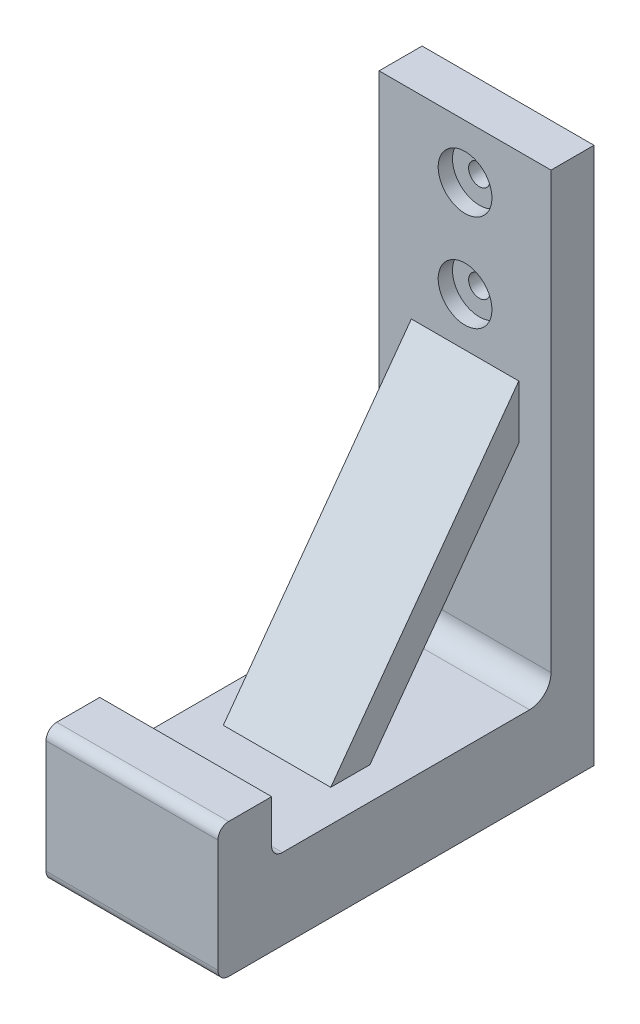
ISO-10303-21;
HEADER;
FILE_DESCRIPTION(('STEP AP214'),'2;1');
FILE_NAME('part.step','',(''),(''),'','','');
FILE_SCHEMA(('AUTOMOTIVE_DESIGN { 1 0 10303 214 1 1 1 1 }'));
ENDSEC;
DATA;
#1=APPLICATION_CONTEXT('core data for automotive mechanical design processes');
#2=APPLICATION_PROTOCOL_DEFINITION('international standard','automotive_design',2000,#1);
#3=PRODUCT_CONTEXT('',#1,'mechanical');
#4=PRODUCT('Part','Part','',(#3));
#5=PRODUCT_RELATED_PRODUCT_CATEGORY('part','',(#4));
#6=PRODUCT_DEFINITION_FORMATION('','',#4);
#7=PRODUCT_DEFINITION_CONTEXT('part definition',#1,'design');
#8=PRODUCT_DEFINITION('design','',#6,#7);
#9=PRODUCT_DEFINITION_SHAPE('','',#8);
#10=(LENGTH_UNIT() NAMED_UNIT(*) SI_UNIT(.MILLI.,.METRE.));
#11=(NAMED_UNIT(*) PLANE_ANGLE_UNIT() SI_UNIT($,.RADIAN.));
#12=(NAMED_UNIT(*) SI_UNIT($,.STERADIAN.) SOLID_ANGLE_UNIT());
#13=UNCERTAINTY_MEASURE_WITH_UNIT(LENGTH_MEASURE(1.E-05),#10,'distance_accuracy_value','');
#14=(GEOMETRIC_REPRESENTATION_CONTEXT(3) GLOBAL_UNCERTAINTY_ASSIGNED_CONTEXT((#13)) GLOBAL_UNIT_ASSIGNED_CONTEXT((#10,
#11,#12)) REPRESENTATION_CONTEXT('',''));
#15=CARTESIAN_POINT('',(0.,0.,0.));
#16=DIRECTION('',(0.,0.,1.));
#17=DIRECTION('',(1.,0.,0.));
#18=AXIS2_PLACEMENT_3D('',#15,#16,#17);
#19=CARTESIAN_POINT('',(20.32,127.,10.16));
#20=DIRECTION('',(0.,0.,-1.));
#21=DIRECTION('',(0.,1.,0.));
#22=AXIS2_PLACEMENT_3D('',#19,#20,#21);
#23=PLANE('',#22);
#24=CARTESIAN_POINT('',(0.,91.44,10.16));
#25=DIRECTION('',(0.,0.,1.));
#26=DIRECTION('',(1.,0.,0.));
#27=AXIS2_PLACEMENT_3D('',#24,#25,#26);
#28=CIRCLE('',#27,6.35);
#29=CARTESIAN_POINT('',(6.35,91.44,10.16));
#30=VERTEX_POINT('',#29);
#31=EDGE_CURVE('E361',#30,#30,#28,.T.);
#32=ORIENTED_EDGE('',*,*,#31,.F.);
#33=EDGE_LOOP('',(#32));
#34=FACE_BOUND('',#33,.T.);
#35=CARTESIAN_POINT('',(0.,114.3,10.16));
#36=DIRECTION('',(0.,0.,1.));
#37=DIRECTION('',(1.,0.,0.));
#38=AXIS2_PLACEMENT_3D('',#35,#36,#37);
#39=CIRCLE('',#38,6.35);
#40=CARTESIAN_POINT('',(6.35,114.3,10.16));
#41=VERTEX_POINT('',#40);
#42=EDGE_CURVE('E343',#41,#41,#39,.T.);
#43=ORIENTED_EDGE('',*,*,#42,.F.);
#44=EDGE_LOOP('',(#43));
#45=FACE_BOUND('',#44,.T.);
#46=DIRECTION('',(0.,-1.,0.));
#47=VECTOR('',#46,1.);
#48=CARTESIAN_POINT('',(-20.32,127.,10.16));
#49=LINE('',#48,#47);
#50=CARTESIAN_POINT('',(-20.32,127.,10.16));
#51=VERTEX_POINT('',#50);
#52=CARTESIAN_POINT('',(-20.32,24.13,10.16));
#53=VERTEX_POINT('',#52);
#54=EDGE_CURVE('E240',#51,#53,#49,.T.);
#55=ORIENTED_EDGE('',*,*,#54,.T.);
#56=DIRECTION('',(-1.,0.,0.));
#57=VECTOR('',#56,1.);
#58=CARTESIAN_POINT('',(20.32,24.13,10.16));
#59=LINE('',#58,#57);
#60=CARTESIAN_POINT('',(20.32,24.13,10.16));
#61=VERTEX_POINT('',#60);
#62=EDGE_CURVE('E275',#53,#61,#59,.F.);
#63=ORIENTED_EDGE('',*,*,#62,.T.);
#64=DIRECTION('',(0.,-1.,0.));
#65=VECTOR('',#64,1.);
#66=CARTESIAN_POINT('',(20.32,127.,10.16));
#67=LINE('',#66,#65);
#68=CARTESIAN_POINT('',(20.32,127.,10.16));
#69=VERTEX_POINT('',#68);
#70=EDGE_CURVE('E212',#69,#61,#67,.T.);
#71=ORIENTED_EDGE('',*,*,#70,.F.);
#72=DIRECTION('',(-1.,0.,0.));
#73=VECTOR('',#72,1.);
#74=CARTESIAN_POINT('',(20.32,127.,10.16));
#75=LINE('',#74,#73);
#76=EDGE_CURVE('E257',#69,#51,#75,.T.);
#77=ORIENTED_EDGE('',*,*,#76,.T.);
#78=EDGE_LOOP('',(#55,#63,#71,#77));
#79=FACE_BOUND('',#78,.T.);
#80=DIRECTION('',(-1.,0.,0.));
#81=VECTOR('',#80,1.);
#82=CARTESIAN_POINT('',(12.7,80.01,10.16));
#83=LINE('',#82,#81);
#84=CARTESIAN_POINT('',(12.7,80.01,10.16));
#85=VERTEX_POINT('',#84);
#86=CARTESIAN_POINT('',(-12.7,80.01,10.16));
#87=VERTEX_POINT('',#86);
#88=EDGE_CURVE('E167',#85,#87,#83,.T.);
#89=ORIENTED_EDGE('',*,*,#88,.F.);
#90=DIRECTION('',(0.,1.,0.));
#91=VECTOR('',#90,1.);
#92=CARTESIAN_POINT('',(12.7,67.31,10.16));
#93=LINE('',#92,#91);
#94=CARTESIAN_POINT('',(12.7,67.31,10.16));
#95=VERTEX_POINT('',#94);
#96=EDGE_CURVE('E165',#95,#85,#93,.T.);
#97=ORIENTED_EDGE('',*,*,#96,.F.);
#98=DIRECTION('',(-1.,0.,0.));
#99=VECTOR('',#98,1.);
#100=CARTESIAN_POINT('',(12.7,67.31,10.16));
#101=LINE('',#100,#99);
#102=CARTESIAN_POINT('',(-12.7,67.31,10.16));
#103=VERTEX_POINT('',#102);
#104=EDGE_CURVE('E157',#95,#103,#101,.T.);
#105=ORIENTED_EDGE('',*,*,#104,.T.);
#106=DIRECTION('',(0.,1.,0.));
#107=VECTOR('',#106,1.);
#108=CARTESIAN_POINT('',(-12.7,67.31,10.16));
#109=LINE('',#108,#107);
#110=EDGE_CURVE('E163',#103,#87,#109,.T.);
#111=ORIENTED_EDGE('',*,*,#110,.T.);
#112=EDGE_LOOP('',(#89,#97,#105,#111));
#113=FACE_BOUND('',#112,.T.);
#114=ADVANCED_FACE('F44',(#34,#45,#79,#113),#23,.F.);
#115=CARTESIAN_POINT('',(20.32,19.05,10.16));
#116=DIRECTION('',(0.,-1.,0.));
#117=DIRECTION('',(0.,0.,-1.));
#118=AXIS2_PLACEMENT_3D('',#115,#116,#117);
#119=PLANE('',#118);
#120=DIRECTION('',(0.,0.,1.));
#121=VECTOR('',#120,1.);
#122=CARTESIAN_POINT('',(-20.32,19.05,10.16));
#123=LINE('',#122,#121);
#124=CARTESIAN_POINT('',(-20.32,19.05,15.24));
#125=VERTEX_POINT('',#124);
#126=CARTESIAN_POINT('',(-20.32,19.05,73.66));
#127=VERTEX_POINT('',#126);
#128=EDGE_CURVE('E241',#125,#127,#123,.T.);
#129=ORIENTED_EDGE('',*,*,#128,.T.);
#130=DIRECTION('',(-1.,0.,0.));
#131=VECTOR('',#130,1.);
#132=CARTESIAN_POINT('',(20.32,19.05,73.66));
#133=LINE('',#132,#131);
#134=CARTESIAN_POINT('',(20.32,19.05,73.66));
#135=VERTEX_POINT('',#134);
#136=EDGE_CURVE('E283',#127,#135,#133,.F.);
#137=ORIENTED_EDGE('',*,*,#136,.T.);
#138=DIRECTION('',(0.,0.,1.));
#139=VECTOR('',#138,1.);
#140=CARTESIAN_POINT('',(20.32,19.05,10.16));
#141=LINE('',#140,#139);
#142=CARTESIAN_POINT('',(20.32,19.05,15.24));
#143=VERTEX_POINT('',#142);
#144=EDGE_CURVE('E213',#143,#135,#141,.T.);
#145=ORIENTED_EDGE('',*,*,#144,.F.);
#146=DIRECTION('',(-1.,0.,0.));
#147=VECTOR('',#146,1.);
#148=CARTESIAN_POINT('',(-20.32,19.05,15.24));
#149=LINE('',#148,#147);
#150=EDGE_CURVE('E267',#143,#125,#149,.T.);
#151=ORIENTED_EDGE('',*,*,#150,.T.);
#152=EDGE_LOOP('',(#129,#137,#145,#151));
#153=FACE_BOUND('',#152,.T.);
#154=DIRECTION('',(0.,0.,-1.));
#155=VECTOR('',#154,1.);
#156=CARTESIAN_POINT('',(12.7,19.05,54.61));
#157=LINE('',#156,#155);
#158=CARTESIAN_POINT('',(12.7,19.05,54.61));
#159=VERTEX_POINT('',#158);
#160=CARTESIAN_POINT('',(12.7,19.05,45.3495833333333));
#161=VERTEX_POINT('',#160);
#162=EDGE_CURVE('E189',#159,#161,#157,.T.);
#163=ORIENTED_EDGE('',*,*,#162,.F.);
#164=DIRECTION('',(-1.,0.,0.));
#165=VECTOR('',#164,1.);
#166=CARTESIAN_POINT('',(12.7,19.05,54.61));
#167=LINE('',#166,#165);
#168=CARTESIAN_POINT('',(-12.7,19.05,54.61));
#169=VERTEX_POINT('',#168);
#170=EDGE_CURVE('E195',#159,#169,#167,.T.);
#171=ORIENTED_EDGE('',*,*,#170,.T.);
#172=DIRECTION('',(0.,0.,-1.));
#173=VECTOR('',#172,1.);
#174=CARTESIAN_POINT('',(-12.7,19.05,54.61));
#175=LINE('',#174,#173);
#176=CARTESIAN_POINT('',(-12.7,19.05,45.3495833333333));
#177=VERTEX_POINT('',#176);
#178=EDGE_CURVE('E177',#169,#177,#175,.T.);
#179=ORIENTED_EDGE('',*,*,#178,.T.);
#180=DIRECTION('',(-1.,0.,0.));
#181=VECTOR('',#180,1.);
#182=CARTESIAN_POINT('',(12.7,19.05,45.3495833333333));
#183=LINE('',#182,#181);
#184=EDGE_CURVE('E169',#161,#177,#183,.T.);
#185=ORIENTED_EDGE('',*,*,#184,.F.);
#186=EDGE_LOOP('',(#163,#171,#179,#185));
#187=FACE_BOUND('',#186,.T.);
#188=ADVANCED_FACE('F375',(#153,#187),#119,.F.);
#189=CARTESIAN_POINT('',(20.32,0.,88.9));
#190=DIRECTION('',(0.,1.,0.));
#191=DIRECTION('',(0.,0.,1.));
#192=AXIS2_PLACEMENT_3D('',#189,#190,#191);
#193=PLANE('',#192);
#194=DIRECTION('',(0.,0.,-1.));
#195=VECTOR('',#194,1.);
#196=CARTESIAN_POINT('',(20.32,0.,88.9));
#197=LINE('',#196,#195);
#198=CARTESIAN_POINT('',(20.32,0.,86.36));
#199=VERTEX_POINT('',#198);
#200=CARTESIAN_POINT('',(20.32,0.,0.));
#201=VERTEX_POINT('',#200);
#202=EDGE_CURVE('E201',#199,#201,#197,.T.);
#203=ORIENTED_EDGE('',*,*,#202,.F.);
#204=DIRECTION('',(-1.,0.,0.));
#205=VECTOR('',#204,1.);
#206=CARTESIAN_POINT('',(20.32,0.,86.36));
#207=LINE('',#206,#205);
#208=CARTESIAN_POINT('',(-20.32,0.,86.36));
#209=VERTEX_POINT('',#208);
#210=EDGE_CURVE('E295',#199,#209,#207,.T.);
#211=ORIENTED_EDGE('',*,*,#210,.T.);
#212=DIRECTION('',(0.,0.,-1.));
#213=VECTOR('',#212,1.);
#214=CARTESIAN_POINT('',(-20.32,0.,88.9));
#215=LINE('',#214,#213);
#216=CARTESIAN_POINT('',(-20.32,0.,0.));
#217=VERTEX_POINT('',#216);
#218=EDGE_CURVE('E198',#209,#217,#215,.T.);
#219=ORIENTED_EDGE('',*,*,#218,.T.);
#220=DIRECTION('',(-1.,0.,0.));
#221=VECTOR('',#220,1.);
#222=CARTESIAN_POINT('',(20.32,0.,0.));
#223=LINE('',#222,#221);
#224=EDGE_CURVE('E261',#201,#217,#223,.T.);
#225=ORIENTED_EDGE('',*,*,#224,.F.);
#226=EDGE_LOOP('',(#203,#211,#219,#225));
#227=FACE_BOUND('',#226,.T.);
#228=ADVANCED_FACE('F418',(#227),#193,.F.);
#229=CARTESIAN_POINT('',(20.32,0.,0.));
#230=DIRECTION('',(0.,0.,1.));
#231=DIRECTION('',(1.,0.,0.));
#232=AXIS2_PLACEMENT_3D('',#229,#230,#231);
#233=PLANE('',#232);
#234=CARTESIAN_POINT('',(0.,91.44,0.));
#235=DIRECTION('',(0.,0.,1.));
#236=DIRECTION('',(1.,0.,0.));
#237=AXIS2_PLACEMENT_3D('',#234,#235,#236);
#238=CIRCLE('',#237,2.54);
#239=CARTESIAN_POINT('',(2.54,91.44,0.));
#240=VERTEX_POINT('',#239);
#241=EDGE_CURVE('E351',#240,#240,#238,.T.);
#242=ORIENTED_EDGE('',*,*,#241,.T.);
#243=EDGE_LOOP('',(#242));
#244=FACE_BOUND('',#243,.T.);
#245=CARTESIAN_POINT('',(0.,114.3,0.));
#246=DIRECTION('',(0.,0.,1.));
#247=DIRECTION('',(1.,0.,0.));
#248=AXIS2_PLACEMENT_3D('',#245,#246,#247);
#249=CIRCLE('',#248,2.54);
#250=CARTESIAN_POINT('',(2.54,114.3,0.));
#251=VERTEX_POINT('',#250);
#252=EDGE_CURVE('E326',#251,#251,#249,.T.);
#253=ORIENTED_EDGE('',*,*,#252,.T.);
#254=EDGE_LOOP('',(#253));
#255=FACE_BOUND('',#254,.T.);
#256=DIRECTION('',(0.,1.,0.));
#257=VECTOR('',#256,1.);
#258=CARTESIAN_POINT('',(-20.32,0.,0.));
#259=LINE('',#258,#257);
#260=CARTESIAN_POINT('',(-20.32,127.,0.));
#261=VERTEX_POINT('',#260);
#262=EDGE_CURVE('E233',#217,#261,#259,.T.);
#263=ORIENTED_EDGE('',*,*,#262,.T.);
#264=DIRECTION('',(-1.,0.,0.));
#265=VECTOR('',#264,1.);
#266=CARTESIAN_POINT('',(20.32,127.,0.));
#267=LINE('',#266,#265);
#268=CARTESIAN_POINT('',(20.32,127.,0.));
#269=VERTEX_POINT('',#268);
#270=EDGE_CURVE('E258',#269,#261,#267,.T.);
#271=ORIENTED_EDGE('',*,*,#270,.F.);
#272=DIRECTION('',(0.,1.,0.));
#273=VECTOR('',#272,1.);
#274=CARTESIAN_POINT('',(20.32,0.,0.));
#275=LINE('',#274,#273);
#276=EDGE_CURVE('E203',#201,#269,#275,.T.);
#277=ORIENTED_EDGE('',*,*,#276,.F.);
#278=ORIENTED_EDGE('',*,*,#224,.T.);
#279=EDGE_LOOP('',(#263,#271,#277,#278));
#280=FACE_BOUND('',#279,.T.);
#281=ADVANCED_FACE('F423',(#244,#255,#280),#233,.F.);
#282=CARTESIAN_POINT('',(20.32,127.,0.));
#283=DIRECTION('',(0.,-1.,0.));
#284=DIRECTION('',(0.,0.,-1.));
#285=AXIS2_PLACEMENT_3D('',#282,#283,#284);
#286=PLANE('',#285);
#287=DIRECTION('',(0.,0.,1.));
#288=VECTOR('',#287,1.);
#289=CARTESIAN_POINT('',(-20.32,127.,0.));
#290=LINE('',#289,#288);
#291=EDGE_CURVE('E234',#261,#51,#290,.T.);
#292=ORIENTED_EDGE('',*,*,#291,.T.);
#293=ORIENTED_EDGE('',*,*,#76,.F.);
#294=DIRECTION('',(0.,0.,1.));
#295=VECTOR('',#294,1.);
#296=CARTESIAN_POINT('',(20.32,127.,0.));
#297=LINE('',#296,#295);
#298=EDGE_CURVE('E206',#269,#69,#297,.T.);
#299=ORIENTED_EDGE('',*,*,#298,.F.);
#300=ORIENTED_EDGE('',*,*,#270,.T.);
#301=EDGE_LOOP('',(#292,#293,#299,#300));
#302=FACE_BOUND('',#301,.T.);
#303=ADVANCED_FACE('F424',(#302),#286,.F.);
#304=CARTESIAN_POINT('',(20.32,19.05,76.2));
#305=DIRECTION('',(0.,0.,1.));
#306=DIRECTION('',(0.,-1.,0.));
#307=AXIS2_PLACEMENT_3D('',#304,#305,#306);
#308=PLANE('',#307);
#309=DIRECTION('',(0.,1.,0.));
#310=VECTOR('',#309,1.);
#311=CARTESIAN_POINT('',(20.32,19.05,76.2));
#312=LINE('',#311,#310);
#313=CARTESIAN_POINT('',(20.32,21.59,76.2));
#314=VERTEX_POINT('',#313);
#315=CARTESIAN_POINT('',(20.32,31.75,76.2));
#316=VERTEX_POINT('',#315);
#317=EDGE_CURVE('E216',#314,#316,#312,.T.);
#318=ORIENTED_EDGE('',*,*,#317,.F.);
#319=DIRECTION('',(-1.,0.,0.));
#320=VECTOR('',#319,1.);
#321=CARTESIAN_POINT('',(-20.32,21.59,76.2));
#322=LINE('',#321,#320);
#323=CARTESIAN_POINT('',(-20.32,21.59,76.2));
#324=VERTEX_POINT('',#323);
#325=EDGE_CURVE('E282',#314,#324,#322,.T.);
#326=ORIENTED_EDGE('',*,*,#325,.T.);
#327=DIRECTION('',(0.,1.,0.));
#328=VECTOR('',#327,1.);
#329=CARTESIAN_POINT('',(-20.32,19.05,76.2));
#330=LINE('',#329,#328);
#331=CARTESIAN_POINT('',(-20.32,31.75,76.2));
#332=VERTEX_POINT('',#331);
#333=EDGE_CURVE('E244',#324,#332,#330,.T.);
#334=ORIENTED_EDGE('',*,*,#333,.T.);
#335=DIRECTION('',(-1.,0.,0.));
#336=VECTOR('',#335,1.);
#337=CARTESIAN_POINT('',(20.32,31.75,76.2));
#338=LINE('',#337,#336);
#339=EDGE_CURVE('E226',#316,#332,#338,.T.);
#340=ORIENTED_EDGE('',*,*,#339,.F.);
#341=EDGE_LOOP('',(#318,#326,#334,#340));
#342=FACE_BOUND('',#341,.T.);
#343=ADVANCED_FACE('F397',(#342),#308,.F.);
#344=CARTESIAN_POINT('',(20.32,31.75,76.2));
#345=DIRECTION('',(0.,-1.,0.));
#346=DIRECTION('',(0.,0.,-1.));
#347=AXIS2_PLACEMENT_3D('',#344,#345,#346);
#348=PLANE('',#347);
#349=DIRECTION('',(0.,0.,1.));
#350=VECTOR('',#349,1.);
#351=CARTESIAN_POINT('',(-20.32,31.75,76.2));
#352=LINE('',#351,#350);
#353=CARTESIAN_POINT('',(-20.32,31.75,86.36));
#354=VERTEX_POINT('',#353);
#355=EDGE_CURVE('E247',#332,#354,#352,.T.);
#356=ORIENTED_EDGE('',*,*,#355,.T.);
#357=DIRECTION('',(-1.,0.,0.));
#358=VECTOR('',#357,1.);
#359=CARTESIAN_POINT('',(20.32,31.75,86.36));
#360=LINE('',#359,#358);
#361=CARTESIAN_POINT('',(20.32,31.75,86.36));
#362=VERTEX_POINT('',#361);
#363=EDGE_CURVE('E53',#354,#362,#360,.F.);
#364=ORIENTED_EDGE('',*,*,#363,.T.);
#365=DIRECTION('',(0.,0.,1.));
#366=VECTOR('',#365,1.);
#367=CARTESIAN_POINT('',(20.32,31.75,76.2));
#368=LINE('',#367,#366);
#369=EDGE_CURVE('E225',#316,#362,#368,.T.);
#370=ORIENTED_EDGE('',*,*,#369,.F.);
#371=ORIENTED_EDGE('',*,*,#339,.T.);
#372=EDGE_LOOP('',(#356,#364,#370,#371));
#373=FACE_BOUND('',#372,.T.);
#374=ADVANCED_FACE('F399',(#373),#348,.F.);
#375=CARTESIAN_POINT('',(20.32,31.75,88.9));
#376=DIRECTION('',(0.,0.,-1.));
#377=DIRECTION('',(-1.,0.,0.));
#378=AXIS2_PLACEMENT_3D('',#375,#376,#377);
#379=PLANE('',#378);
#380=DIRECTION('',(0.,-1.,0.));
#381=VECTOR('',#380,1.);
#382=CARTESIAN_POINT('',(20.32,31.75,88.9));
#383=LINE('',#382,#381);
#384=CARTESIAN_POINT('',(20.32,29.21,88.9));
#385=VERTEX_POINT('',#384);
#386=CARTESIAN_POINT('',(20.32,2.54,88.9));
#387=VERTEX_POINT('',#386);
#388=EDGE_CURVE('E224',#385,#387,#383,.T.);
#389=ORIENTED_EDGE('',*,*,#388,.F.);
#390=DIRECTION('',(-1.,0.,0.));
#391=VECTOR('',#390,1.);
#392=CARTESIAN_POINT('',(20.32,29.21,88.9));
#393=LINE('',#392,#391);
#394=CARTESIAN_POINT('',(-20.32,29.21,88.9));
#395=VERTEX_POINT('',#394);
#396=EDGE_CURVE('E307',#385,#395,#393,.T.);
#397=ORIENTED_EDGE('',*,*,#396,.T.);
#398=DIRECTION('',(0.,-1.,0.));
#399=VECTOR('',#398,1.);
#400=CARTESIAN_POINT('',(-20.32,31.75,88.9));
#401=LINE('',#400,#399);
#402=CARTESIAN_POINT('',(-20.32,2.54,88.9));
#403=VERTEX_POINT('',#402);
#404=EDGE_CURVE('E204',#395,#403,#401,.T.);
#405=ORIENTED_EDGE('',*,*,#404,.T.);
#406=DIRECTION('',(-1.,0.,0.));
#407=VECTOR('',#406,1.);
#408=CARTESIAN_POINT('',(20.32,2.54,88.9));
#409=LINE('',#408,#407);
#410=EDGE_CURVE('E305',#403,#387,#409,.F.);
#411=ORIENTED_EDGE('',*,*,#410,.T.);
#412=EDGE_LOOP('',(#389,#397,#405,#411));
#413=FACE_BOUND('',#412,.T.);
#414=ADVANCED_FACE('F407',(#413),#379,.F.);
#415=CARTESIAN_POINT('',(20.32,0.,0.));
#416=DIRECTION('',(1.,0.,0.));
#417=DIRECTION('',(0.,0.,-1.));
#418=AXIS2_PLACEMENT_3D('',#415,#416,#417);
#419=PLANE('',#418);
#420=ORIENTED_EDGE('',*,*,#369,.T.);
#421=CARTESIAN_POINT('',(20.32,29.21,86.36));
#422=DIRECTION('',(1.,0.,0.));
#423=DIRECTION('',(0.,0.,-1.));
#424=AXIS2_PLACEMENT_3D('',#421,#422,#423);
#425=CIRCLE('',#424,2.54);
#426=EDGE_CURVE('E11',#362,#385,#425,.T.);
#427=ORIENTED_EDGE('',*,*,#426,.T.);
#428=ORIENTED_EDGE('',*,*,#388,.T.);
#429=CARTESIAN_POINT('',(20.32,2.54,86.36));
#430=DIRECTION('',(1.,0.,0.));
#431=DIRECTION('',(0.,0.,-1.));
#432=AXIS2_PLACEMENT_3D('',#429,#430,#431);
#433=CIRCLE('',#432,2.54);
#434=EDGE_CURVE('E306',#387,#199,#433,.T.);
#435=ORIENTED_EDGE('',*,*,#434,.T.);
#436=ORIENTED_EDGE('',*,*,#202,.T.);
#437=ORIENTED_EDGE('',*,*,#276,.T.);
#438=ORIENTED_EDGE('',*,*,#298,.T.);
#439=ORIENTED_EDGE('',*,*,#70,.T.);
#440=CARTESIAN_POINT('',(20.32,24.13,15.24));
#441=DIRECTION('',(1.,0.,0.));
#442=DIRECTION('',(0.,0.,-1.));
#443=AXIS2_PLACEMENT_3D('',#440,#441,#442);
#444=CIRCLE('',#443,5.08);
#445=EDGE_CURVE('E279',#61,#143,#444,.F.);
#446=ORIENTED_EDGE('',*,*,#445,.T.);
#447=ORIENTED_EDGE('',*,*,#144,.T.);
#448=CARTESIAN_POINT('',(20.32,21.59,73.66));
#449=DIRECTION('',(1.,0.,0.));
#450=DIRECTION('',(0.,0.,-1.));
#451=AXIS2_PLACEMENT_3D('',#448,#449,#450);
#452=CIRCLE('',#451,2.54);
#453=EDGE_CURVE('E293',#135,#314,#452,.F.);
#454=ORIENTED_EDGE('',*,*,#453,.T.);
#455=ORIENTED_EDGE('',*,*,#317,.T.);
#456=EDGE_LOOP('',(#420,#427,#428,#435,#436,#437,#438,#439,#446,#447,#454,#455));
#457=FACE_BOUND('',#456,.T.);
#458=ADVANCED_FACE('F390',(#457),#419,.T.);
#459=CARTESIAN_POINT('',(-20.32,0.,0.));
#460=DIRECTION('',(1.,0.,0.));
#461=DIRECTION('',(0.,0.,-1.));
#462=AXIS2_PLACEMENT_3D('',#459,#460,#461);
#463=PLANE('',#462);
#464=ORIENTED_EDGE('',*,*,#404,.F.);
#465=CARTESIAN_POINT('',(-20.32,29.21,86.36));
#466=DIRECTION('',(1.,0.,0.));
#467=DIRECTION('',(0.,0.,-1.));
#468=AXIS2_PLACEMENT_3D('',#465,#466,#467);
#469=CIRCLE('',#468,2.54);
#470=EDGE_CURVE('E69',#395,#354,#469,.F.);
#471=ORIENTED_EDGE('',*,*,#470,.T.);
#472=ORIENTED_EDGE('',*,*,#355,.F.);
#473=ORIENTED_EDGE('',*,*,#333,.F.);
#474=CARTESIAN_POINT('',(-20.32,21.59,73.66));
#475=DIRECTION('',(1.,0.,0.));
#476=DIRECTION('',(0.,0.,-1.));
#477=AXIS2_PLACEMENT_3D('',#474,#475,#476);
#478=CIRCLE('',#477,2.54);
#479=EDGE_CURVE('E287',#324,#127,#478,.T.);
#480=ORIENTED_EDGE('',*,*,#479,.T.);
#481=ORIENTED_EDGE('',*,*,#128,.F.);
#482=CARTESIAN_POINT('',(-20.32,24.13,15.24));
#483=DIRECTION('',(1.,0.,0.));
#484=DIRECTION('',(0.,0.,-1.));
#485=AXIS2_PLACEMENT_3D('',#482,#483,#484);
#486=CIRCLE('',#485,5.08);
#487=EDGE_CURVE('E273',#125,#53,#486,.T.);
#488=ORIENTED_EDGE('',*,*,#487,.T.);
#489=ORIENTED_EDGE('',*,*,#54,.F.);
#490=ORIENTED_EDGE('',*,*,#291,.F.);
#491=ORIENTED_EDGE('',*,*,#262,.F.);
#492=ORIENTED_EDGE('',*,*,#218,.F.);
#493=CARTESIAN_POINT('',(-20.32,2.54,86.36));
#494=DIRECTION('',(1.,0.,0.));
#495=DIRECTION('',(0.,0.,-1.));
#496=AXIS2_PLACEMENT_3D('',#493,#494,#495);
#497=CIRCLE('',#496,2.54);
#498=EDGE_CURVE('E296',#209,#403,#497,.F.);
#499=ORIENTED_EDGE('',*,*,#498,.T.);
#500=EDGE_LOOP('',(#464,#471,#472,#473,#480,#481,#488,#489,#490,#491,#492,#499));
#501=FACE_BOUND('',#500,.T.);
#502=ADVANCED_FACE('F410',(#501),#463,.F.);
#503=CARTESIAN_POINT('',(12.7,19.05,45.3495833333333));
#504=DIRECTION('',(0.,0.589172157449442,0.808007530216377));
#505=DIRECTION('',(0.,-0.808007530216378,0.589172157449442));
#506=AXIS2_PLACEMENT_3D('',#503,#504,#505);
#507=PLANE('',#506);
#508=DIRECTION('',(0.,0.808007530216377,-0.589172157449442));
#509=VECTOR('',#508,1.);
#510=CARTESIAN_POINT('',(-12.7,19.05,45.3495833333333));
#511=LINE('',#510,#509);
#512=EDGE_CURVE('E172',#177,#103,#511,.T.);
#513=ORIENTED_EDGE('',*,*,#512,.T.);
#514=ORIENTED_EDGE('',*,*,#104,.F.);
#515=DIRECTION('',(0.,0.808007530216377,-0.589172157449442));
#516=VECTOR('',#515,1.);
#517=CARTESIAN_POINT('',(12.7,19.05,45.3495833333333));
#518=LINE('',#517,#516);
#519=EDGE_CURVE('E318',#161,#95,#518,.T.);
#520=ORIENTED_EDGE('',*,*,#519,.F.);
#521=ORIENTED_EDGE('',*,*,#184,.T.);
#522=EDGE_LOOP('',(#513,#514,#520,#521));
#523=FACE_BOUND('',#522,.T.);
#524=ADVANCED_FACE('F174',(#523),#507,.F.);
#525=CARTESIAN_POINT('',(12.7,19.05,54.61));
#526=DIRECTION('',(0.,0.589172157449442,0.808007530216378));
#527=DIRECTION('',(0.,-0.808007530216378,0.589172157449442));
#528=AXIS2_PLACEMENT_3D('',#525,#526,#527);
#529=PLANE('',#528);
#530=DIRECTION('',(0.,0.808007530216378,-0.589172157449442));
#531=VECTOR('',#530,1.);
#532=CARTESIAN_POINT('',(-12.7,19.05,54.61));
#533=LINE('',#532,#531);
#534=EDGE_CURVE('E183',#169,#87,#533,.T.);
#535=ORIENTED_EDGE('',*,*,#534,.F.);
#536=ORIENTED_EDGE('',*,*,#170,.F.);
#537=DIRECTION('',(0.,0.808007530216378,-0.589172157449442));
#538=VECTOR('',#537,1.);
#539=CARTESIAN_POINT('',(12.7,19.05,54.61));
#540=LINE('',#539,#538);
#541=EDGE_CURVE('E193',#159,#85,#540,.T.);
#542=ORIENTED_EDGE('',*,*,#541,.T.);
#543=ORIENTED_EDGE('',*,*,#88,.T.);
#544=EDGE_LOOP('',(#535,#536,#542,#543));
#545=FACE_BOUND('',#544,.T.);
#546=ADVANCED_FACE('F597',(#545),#529,.T.);
#547=CARTESIAN_POINT('',(12.7,0.,0.));
#548=DIRECTION('',(1.,0.,0.));
#549=DIRECTION('',(0.,0.,-1.));
#550=AXIS2_PLACEMENT_3D('',#547,#548,#549);
#551=PLANE('',#550);
#552=ORIENTED_EDGE('',*,*,#162,.T.);
#553=ORIENTED_EDGE('',*,*,#519,.T.);
#554=ORIENTED_EDGE('',*,*,#96,.T.);
#555=ORIENTED_EDGE('',*,*,#541,.F.);
#556=EDGE_LOOP('',(#552,#553,#554,#555));
#557=FACE_BOUND('',#556,.T.);
#558=ADVANCED_FACE('F590',(#557),#551,.T.);
#559=CARTESIAN_POINT('',(-12.7,0.,0.));
#560=DIRECTION('',(1.,0.,0.));
#561=DIRECTION('',(0.,0.,-1.));
#562=AXIS2_PLACEMENT_3D('',#559,#560,#561);
#563=PLANE('',#562);
#564=ORIENTED_EDGE('',*,*,#178,.F.);
#565=ORIENTED_EDGE('',*,*,#534,.T.);
#566=ORIENTED_EDGE('',*,*,#110,.F.);
#567=ORIENTED_EDGE('',*,*,#512,.F.);
#568=EDGE_LOOP('',(#564,#565,#566,#567));
#569=FACE_BOUND('',#568,.T.);
#570=ADVANCED_FACE('F185',(#569),#563,.F.);
#571=CARTESIAN_POINT('',(0.,114.3,10.16));
#572=DIRECTION('',(0.,0.,1.));
#573=DIRECTION('',(1.,0.,0.));
#574=AXIS2_PLACEMENT_3D('',#571,#572,#573);
#575=CYLINDRICAL_SURFACE('',#574,2.54);
#576=ORIENTED_EDGE('',*,*,#252,.F.);
#577=EDGE_LOOP('',(#576));
#578=FACE_BOUND('',#577,.T.);
#579=CARTESIAN_POINT('',(0.,114.3,6.78179999999999));
#580=DIRECTION('',(0.,0.,1.));
#581=DIRECTION('',(1.,0.,0.));
#582=AXIS2_PLACEMENT_3D('',#579,#580,#581);
#583=CIRCLE('',#582,2.54);
#584=CARTESIAN_POINT('',(2.54,114.3,6.78179999999999));
#585=VERTEX_POINT('',#584);
#586=EDGE_CURVE('E334',#585,#585,#583,.T.);
#587=ORIENTED_EDGE('',*,*,#586,.T.);
#588=EDGE_LOOP('',(#587));
#589=FACE_BOUND('',#588,.T.);
#590=ADVANCED_FACE('F569',(#578,#589),#575,.F.);
#591=CARTESIAN_POINT('',(2.54,114.3,6.78179999999999));
#592=DIRECTION('',(0.,0.,-1.));
#593=DIRECTION('',(-1.,0.,0.));
#594=AXIS2_PLACEMENT_3D('',#591,#592,#593);
#595=PLANE('',#594);
#596=ORIENTED_EDGE('',*,*,#586,.F.);
#597=EDGE_LOOP('',(#596));
#598=FACE_BOUND('',#597,.T.);
#599=CARTESIAN_POINT('',(0.,114.3,6.78179999999999));
#600=DIRECTION('',(0.,0.,1.));
#601=DIRECTION('',(1.,0.,0.));
#602=AXIS2_PLACEMENT_3D('',#599,#600,#601);
#603=CIRCLE('',#602,6.35);
#604=CARTESIAN_POINT('',(6.35,114.3,6.78179999999999));
#605=VERTEX_POINT('',#604);
#606=EDGE_CURVE('E338',#605,#605,#603,.T.);
#607=ORIENTED_EDGE('',*,*,#606,.T.);
#608=EDGE_LOOP('',(#607));
#609=FACE_BOUND('',#608,.T.);
#610=ADVANCED_FACE('F557',(#598,#609),#595,.F.);
#611=CARTESIAN_POINT('',(0.,114.3,10.16));
#612=DIRECTION('',(0.,0.,1.));
#613=DIRECTION('',(1.,0.,0.));
#614=AXIS2_PLACEMENT_3D('',#611,#612,#613);
#615=CYLINDRICAL_SURFACE('',#614,6.35);
#616=ORIENTED_EDGE('',*,*,#606,.F.);
#617=EDGE_LOOP('',(#616));
#618=FACE_BOUND('',#617,.T.);
#619=ORIENTED_EDGE('',*,*,#42,.T.);
#620=EDGE_LOOP('',(#619));
#621=FACE_BOUND('',#620,.T.);
#622=ADVANCED_FACE('F549',(#618,#621),#615,.F.);
#623=CARTESIAN_POINT('',(0.,91.44,10.16));
#624=DIRECTION('',(0.,0.,1.));
#625=DIRECTION('',(1.,0.,0.));
#626=AXIS2_PLACEMENT_3D('',#623,#624,#625);
#627=CYLINDRICAL_SURFACE('',#626,2.54);
#628=ORIENTED_EDGE('',*,*,#241,.F.);
#629=EDGE_LOOP('',(#628));
#630=FACE_BOUND('',#629,.T.);
#631=CARTESIAN_POINT('',(0.,91.44,6.78179999999999));
#632=DIRECTION('',(0.,0.,1.));
#633=DIRECTION('',(1.,0.,0.));
#634=AXIS2_PLACEMENT_3D('',#631,#632,#633);
#635=CIRCLE('',#634,2.54);
#636=CARTESIAN_POINT('',(2.54,91.44,6.78179999999999));
#637=VERTEX_POINT('',#636);
#638=EDGE_CURVE('E354',#637,#637,#635,.T.);
#639=ORIENTED_EDGE('',*,*,#638,.T.);
#640=EDGE_LOOP('',(#639));
#641=FACE_BOUND('',#640,.T.);
#642=ADVANCED_FACE('F538',(#630,#641),#627,.F.);
#643=CARTESIAN_POINT('',(2.54,91.44,6.78179999999999));
#644=DIRECTION('',(0.,0.,-1.));
#645=DIRECTION('',(-1.,0.,0.));
#646=AXIS2_PLACEMENT_3D('',#643,#644,#645);
#647=PLANE('',#646);
#648=ORIENTED_EDGE('',*,*,#638,.F.);
#649=EDGE_LOOP('',(#648));
#650=FACE_BOUND('',#649,.T.);
#651=CARTESIAN_POINT('',(0.,91.44,6.78179999999999));
#652=DIRECTION('',(0.,0.,1.));
#653=DIRECTION('',(1.,0.,0.));
#654=AXIS2_PLACEMENT_3D('',#651,#652,#653);
#655=CIRCLE('',#654,6.35);
#656=CARTESIAN_POINT('',(6.35,91.44,6.78179999999999));
#657=VERTEX_POINT('',#656);
#658=EDGE_CURVE('E360',#657,#657,#655,.T.);
#659=ORIENTED_EDGE('',*,*,#658,.T.);
#660=EDGE_LOOP('',(#659));
#661=FACE_BOUND('',#660,.T.);
#662=ADVANCED_FACE('F529',(#650,#661),#647,.F.);
#663=CARTESIAN_POINT('',(0.,91.44,10.16));
#664=DIRECTION('',(0.,0.,1.));
#665=DIRECTION('',(1.,0.,0.));
#666=AXIS2_PLACEMENT_3D('',#663,#664,#665);
#667=CYLINDRICAL_SURFACE('',#666,6.35);
#668=ORIENTED_EDGE('',*,*,#658,.F.);
#669=EDGE_LOOP('',(#668));
#670=FACE_BOUND('',#669,.T.);
#671=ORIENTED_EDGE('',*,*,#31,.T.);
#672=EDGE_LOOP('',(#671));
#673=FACE_BOUND('',#672,.T.);
#674=ADVANCED_FACE('F368',(#670,#673),#667,.F.);
#675=CARTESIAN_POINT('',(20.32,24.13,15.24));
#676=DIRECTION('',(1.,0.,0.));
#677=DIRECTION('',(0.,0.,-1.));
#678=AXIS2_PLACEMENT_3D('',#675,#676,#677);
#679=CYLINDRICAL_SURFACE('',#678,5.08);
#680=ORIENTED_EDGE('',*,*,#445,.F.);
#681=ORIENTED_EDGE('',*,*,#62,.F.);
#682=ORIENTED_EDGE('',*,*,#487,.F.);
#683=ORIENTED_EDGE('',*,*,#150,.F.);
#684=EDGE_LOOP('',(#680,#681,#682,#683));
#685=FACE_BOUND('',#684,.T.);
#686=ADVANCED_FACE('F384',(#685),#679,.F.);
#687=CARTESIAN_POINT('',(20.32,21.59,73.66));
#688=DIRECTION('',(1.,0.,0.));
#689=DIRECTION('',(0.,0.,-1.));
#690=AXIS2_PLACEMENT_3D('',#687,#688,#689);
#691=CYLINDRICAL_SURFACE('',#690,2.54);
#692=ORIENTED_EDGE('',*,*,#453,.F.);
#693=ORIENTED_EDGE('',*,*,#136,.F.);
#694=ORIENTED_EDGE('',*,*,#479,.F.);
#695=ORIENTED_EDGE('',*,*,#325,.F.);
#696=EDGE_LOOP('',(#692,#693,#694,#695));
#697=FACE_BOUND('',#696,.T.);
#698=ADVANCED_FACE('F394',(#697),#691,.F.);
#699=CARTESIAN_POINT('',(20.32,2.54,86.36));
#700=DIRECTION('',(-1.,0.,0.));
#701=DIRECTION('',(0.,0.,1.));
#702=AXIS2_PLACEMENT_3D('',#699,#700,#701);
#703=CYLINDRICAL_SURFACE('',#702,2.54);
#704=ORIENTED_EDGE('',*,*,#434,.F.);
#705=ORIENTED_EDGE('',*,*,#410,.F.);
#706=ORIENTED_EDGE('',*,*,#498,.F.);
#707=ORIENTED_EDGE('',*,*,#210,.F.);
#708=EDGE_LOOP('',(#704,#705,#706,#707));
#709=FACE_BOUND('',#708,.T.);
#710=ADVANCED_FACE('F411',(#709),#703,.T.);
#711=CARTESIAN_POINT('',(20.32,29.21,86.36));
#712=DIRECTION('',(-1.,0.,0.));
#713=DIRECTION('',(0.,0.,1.));
#714=AXIS2_PLACEMENT_3D('',#711,#712,#713);
#715=CYLINDRICAL_SURFACE('',#714,2.54);
#716=ORIENTED_EDGE('',*,*,#426,.F.);
#717=ORIENTED_EDGE('',*,*,#363,.F.);
#718=ORIENTED_EDGE('',*,*,#470,.F.);
#719=ORIENTED_EDGE('',*,*,#396,.F.);
#720=EDGE_LOOP('',(#716,#717,#718,#719));
#721=FACE_BOUND('',#720,.T.);
#722=ADVANCED_FACE('F50',(#721),#715,.T.);
#723=CLOSED_SHELL('',(#114,#188,#228,#281,#303,#343,#374,#414,#458,#502,#524,#546,#558,#570,
#590,#610,#622,#642,#662,#674,#686,#698,#710,#722));
#724=MANIFOLD_SOLID_BREP('B2',#723);
#725=ADVANCED_BREP_SHAPE_REPRESENTATION('',(#18,#724),#14);
#726=SHAPE_DEFINITION_REPRESENTATION(#9,#725);
ENDSEC;
END-ISO-10303-21;
